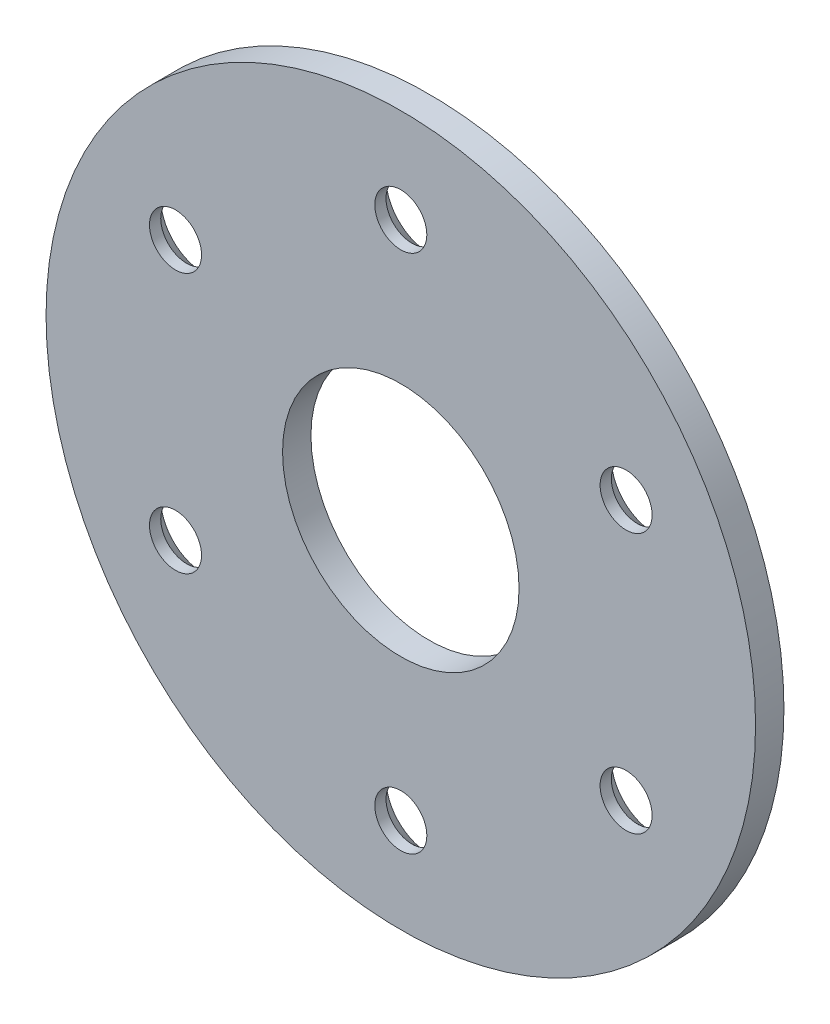
ISO-10303-21;
HEADER;
FILE_DESCRIPTION(('STEP AP214'),'2;1');
FILE_NAME('part.step','',(''),(''),'','','');
FILE_SCHEMA(('AUTOMOTIVE_DESIGN { 1 0 10303 214 1 1 1 1 }'));
ENDSEC;
DATA;
#1=APPLICATION_CONTEXT('core data for automotive mechanical design processes');
#2=APPLICATION_PROTOCOL_DEFINITION('international standard','automotive_design',2000,#1);
#3=PRODUCT_CONTEXT('',#1,'mechanical');
#4=PRODUCT('Part','Part','',(#3));
#5=PRODUCT_RELATED_PRODUCT_CATEGORY('part','',(#4));
#6=PRODUCT_DEFINITION_FORMATION('','',#4);
#7=PRODUCT_DEFINITION_CONTEXT('part definition',#1,'design');
#8=PRODUCT_DEFINITION('design','',#6,#7);
#9=PRODUCT_DEFINITION_SHAPE('','',#8);
#10=(LENGTH_UNIT() NAMED_UNIT(*) SI_UNIT(.MILLI.,.METRE.));
#11=(NAMED_UNIT(*) PLANE_ANGLE_UNIT() SI_UNIT($,.RADIAN.));
#12=(NAMED_UNIT(*) SI_UNIT($,.STERADIAN.) SOLID_ANGLE_UNIT());
#13=UNCERTAINTY_MEASURE_WITH_UNIT(LENGTH_MEASURE(1.E-05),#10,'distance_accuracy_value','');
#14=(GEOMETRIC_REPRESENTATION_CONTEXT(3) GLOBAL_UNCERTAINTY_ASSIGNED_CONTEXT((#13)) GLOBAL_UNIT_ASSIGNED_CONTEXT((#10,
#11,#12)) REPRESENTATION_CONTEXT('',''));
#15=CARTESIAN_POINT('',(0.,0.,0.));
#16=DIRECTION('',(0.,0.,1.));
#17=DIRECTION('',(1.,0.,0.));
#18=AXIS2_PLACEMENT_3D('',#15,#16,#17);
#19=CARTESIAN_POINT('',(0.,0.,3.));
#20=DIRECTION('',(0.,0.,1.));
#21=DIRECTION('',(1.,0.,0.));
#22=AXIS2_PLACEMENT_3D('',#19,#20,#21);
#23=PLANE('',#22);
#24=CARTESIAN_POINT('',(-47.6313972081407,-27.500000000002,3.));
#25=DIRECTION('',(0.,0.,1.));
#26=DIRECTION('',(1.,0.,0.));
#27=AXIS2_PLACEMENT_3D('',#24,#25,#26);
#28=CIRCLE('',#27,5.5);
#29=CARTESIAN_POINT('',(-42.1313972081407,-27.500000000002,3.));
#30=VERTEX_POINT('',#29);
#31=EDGE_CURVE('E80',#30,#30,#28,.T.);
#32=ORIENTED_EDGE('',*,*,#31,.F.);
#33=EDGE_LOOP('',(#32));
#34=FACE_BOUND('',#33,.T.);
#35=CARTESIAN_POINT('',(47.6313972081475,-27.499999999998,3.));
#36=DIRECTION('',(0.,0.,1.));
#37=DIRECTION('',(1.,0.,0.));
#38=AXIS2_PLACEMENT_3D('',#35,#36,#37);
#39=CIRCLE('',#38,5.5);
#40=CARTESIAN_POINT('',(53.1313972081475,-27.499999999998,3.));
#41=VERTEX_POINT('',#40);
#42=EDGE_CURVE('E72',#41,#41,#39,.T.);
#43=ORIENTED_EDGE('',*,*,#42,.F.);
#44=EDGE_LOOP('',(#43));
#45=FACE_BOUND('',#44,.T.);
#46=CARTESIAN_POINT('',(0.,55.,3.));
#47=DIRECTION('',(0.,0.,1.));
#48=DIRECTION('',(1.,0.,0.));
#49=AXIS2_PLACEMENT_3D('',#46,#47,#48);
#50=CIRCLE('',#49,5.5);
#51=CARTESIAN_POINT('',(5.5,55.,3.));
#52=VERTEX_POINT('',#51);
#53=EDGE_CURVE('E61',#52,#52,#50,.T.);
#54=ORIENTED_EDGE('',*,*,#53,.F.);
#55=EDGE_LOOP('',(#54));
#56=FACE_BOUND('',#55,.T.);
#57=CARTESIAN_POINT('',(0.,0.,3.));
#58=DIRECTION('',(0.,0.,1.));
#59=DIRECTION('',(1.,0.,0.));
#60=AXIS2_PLACEMENT_3D('',#57,#58,#59);
#61=CIRCLE('',#60,75.);
#62=CARTESIAN_POINT('',(75.,0.,3.));
#63=VERTEX_POINT('',#62);
#64=EDGE_CURVE('E10',#63,#63,#61,.T.);
#65=ORIENTED_EDGE('',*,*,#64,.T.);
#66=EDGE_LOOP('',(#65));
#67=FACE_BOUND('',#66,.T.);
#68=CARTESIAN_POINT('',(0.,0.,3.));
#69=DIRECTION('',(0.,0.,1.));
#70=DIRECTION('',(1.,0.,0.));
#71=AXIS2_PLACEMENT_3D('',#68,#69,#70);
#72=CIRCLE('',#71,25.);
#73=CARTESIAN_POINT('',(25.,0.,3.));
#74=VERTEX_POINT('',#73);
#75=EDGE_CURVE('E55',#74,#74,#72,.T.);
#76=ORIENTED_EDGE('',*,*,#75,.F.);
#77=EDGE_LOOP('',(#76));
#78=FACE_BOUND('',#77,.T.);
#79=CARTESIAN_POINT('',(47.6313972081453,27.500000000002,3.));
#80=DIRECTION('',(0.,0.,1.));
#81=DIRECTION('',(1.,0.,0.));
#82=AXIS2_PLACEMENT_3D('',#79,#80,#81);
#83=CIRCLE('',#82,5.5);
#84=CARTESIAN_POINT('',(53.1313972081453,27.500000000002,3.));
#85=VERTEX_POINT('',#84);
#86=EDGE_CURVE('E68',#85,#85,#83,.T.);
#87=ORIENTED_EDGE('',*,*,#86,.F.);
#88=EDGE_LOOP('',(#87));
#89=FACE_BOUND('',#88,.T.);
#90=CARTESIAN_POINT('',(4.5346147174736E-12,-55.,3.));
#91=DIRECTION('',(0.,0.,1.));
#92=DIRECTION('',(1.,0.,0.));
#93=AXIS2_PLACEMENT_3D('',#90,#91,#92);
#94=CIRCLE('',#93,5.5);
#95=CARTESIAN_POINT('',(5.50000000000453,-55.,3.));
#96=VERTEX_POINT('',#95);
#97=EDGE_CURVE('E76',#96,#96,#94,.T.);
#98=ORIENTED_EDGE('',*,*,#97,.F.);
#99=EDGE_LOOP('',(#98));
#100=FACE_BOUND('',#99,.T.);
#101=CARTESIAN_POINT('',(-47.631397208143,27.499999999998,3.));
#102=DIRECTION('',(0.,0.,1.));
#103=DIRECTION('',(1.,0.,0.));
#104=AXIS2_PLACEMENT_3D('',#101,#102,#103);
#105=CIRCLE('',#104,5.5);
#106=CARTESIAN_POINT('',(-42.131397208143,27.499999999998,3.));
#107=VERTEX_POINT('',#106);
#108=EDGE_CURVE('E84',#107,#107,#105,.T.);
#109=ORIENTED_EDGE('',*,*,#108,.F.);
#110=EDGE_LOOP('',(#109));
#111=FACE_BOUND('',#110,.T.);
#112=ADVANCED_FACE('F41',(#34,#45,#56,#67,#78,#89,#100,#111),#23,.T.);
#113=CARTESIAN_POINT('',(0.,0.,-3.));
#114=DIRECTION('',(0.,0.,1.));
#115=DIRECTION('',(1.,0.,0.));
#116=AXIS2_PLACEMENT_3D('',#113,#114,#115);
#117=PLANE('',#116);
#118=CARTESIAN_POINT('',(0.,55.,-3.));
#119=DIRECTION('',(0.,0.,-1.));
#120=DIRECTION('',(-1.,0.,0.));
#121=AXIS2_PLACEMENT_3D('',#118,#119,#120);
#122=CIRCLE('',#121,9.125);
#123=CARTESIAN_POINT('',(-9.125,55.,-3.));
#124=VERTEX_POINT('',#123);
#125=EDGE_CURVE('E132',#124,#124,#122,.T.);
#126=ORIENTED_EDGE('',*,*,#125,.F.);
#127=EDGE_LOOP('',(#126));
#128=FACE_BOUND('',#127,.T.);
#129=CARTESIAN_POINT('',(-47.631397208143,27.499999999998,-3.));
#130=DIRECTION('',(0.,0.,-1.));
#131=DIRECTION('',(-1.,0.,0.));
#132=AXIS2_PLACEMENT_3D('',#129,#130,#131);
#133=CIRCLE('',#132,9.125);
#134=CARTESIAN_POINT('',(-56.756397208143,27.499999999998,-3.));
#135=VERTEX_POINT('',#134);
#136=EDGE_CURVE('E124',#135,#135,#133,.T.);
#137=ORIENTED_EDGE('',*,*,#136,.F.);
#138=EDGE_LOOP('',(#137));
#139=FACE_BOUND('',#138,.T.);
#140=CARTESIAN_POINT('',(-47.6313972081407,-27.500000000002,-3.));
#141=DIRECTION('',(0.,0.,-1.));
#142=DIRECTION('',(-1.,0.,0.));
#143=AXIS2_PLACEMENT_3D('',#140,#141,#142);
#144=CIRCLE('',#143,9.125);
#145=CARTESIAN_POINT('',(-56.7563972081407,-27.500000000002,-3.));
#146=VERTEX_POINT('',#145);
#147=EDGE_CURVE('E116',#146,#146,#144,.T.);
#148=ORIENTED_EDGE('',*,*,#147,.F.);
#149=EDGE_LOOP('',(#148));
#150=FACE_BOUND('',#149,.T.);
#151=CARTESIAN_POINT('',(4.5346147174736E-12,-55.,-3.));
#152=DIRECTION('',(0.,0.,-1.));
#153=DIRECTION('',(-1.,0.,0.));
#154=AXIS2_PLACEMENT_3D('',#151,#152,#153);
#155=CIRCLE('',#154,9.125);
#156=CARTESIAN_POINT('',(-9.12499999999546,-55.,-3.));
#157=VERTEX_POINT('',#156);
#158=EDGE_CURVE('E108',#157,#157,#155,.T.);
#159=ORIENTED_EDGE('',*,*,#158,.F.);
#160=EDGE_LOOP('',(#159));
#161=FACE_BOUND('',#160,.T.);
#162=CARTESIAN_POINT('',(47.6313972081475,-27.499999999998,-3.));
#163=DIRECTION('',(0.,0.,-1.));
#164=DIRECTION('',(-1.,0.,0.));
#165=AXIS2_PLACEMENT_3D('',#162,#163,#164);
#166=CIRCLE('',#165,9.125);
#167=CARTESIAN_POINT('',(38.5063972081475,-27.499999999998,-3.));
#168=VERTEX_POINT('',#167);
#169=EDGE_CURVE('E100',#168,#168,#166,.T.);
#170=ORIENTED_EDGE('',*,*,#169,.F.);
#171=EDGE_LOOP('',(#170));
#172=FACE_BOUND('',#171,.T.);
#173=CARTESIAN_POINT('',(47.6313972081453,27.500000000002,-3.));
#174=DIRECTION('',(0.,0.,-1.));
#175=DIRECTION('',(-1.,0.,0.));
#176=AXIS2_PLACEMENT_3D('',#173,#174,#175);
#177=CIRCLE('',#176,9.125);
#178=CARTESIAN_POINT('',(38.5063972081453,27.500000000002,-3.));
#179=VERTEX_POINT('',#178);
#180=EDGE_CURVE('E92',#179,#179,#177,.T.);
#181=ORIENTED_EDGE('',*,*,#180,.F.);
#182=EDGE_LOOP('',(#181));
#183=FACE_BOUND('',#182,.T.);
#184=CARTESIAN_POINT('',(0.,0.,-3.));
#185=DIRECTION('',(0.,0.,1.));
#186=DIRECTION('',(1.,0.,0.));
#187=AXIS2_PLACEMENT_3D('',#184,#185,#186);
#188=CIRCLE('',#187,75.);
#189=CARTESIAN_POINT('',(75.,0.,-3.));
#190=VERTEX_POINT('',#189);
#191=EDGE_CURVE('E45',#190,#190,#188,.T.);
#192=ORIENTED_EDGE('',*,*,#191,.F.);
#193=EDGE_LOOP('',(#192));
#194=FACE_BOUND('',#193,.T.);
#195=CARTESIAN_POINT('',(0.,0.,-3.));
#196=DIRECTION('',(0.,0.,1.));
#197=DIRECTION('',(1.,0.,0.));
#198=AXIS2_PLACEMENT_3D('',#195,#196,#197);
#199=CIRCLE('',#198,25.);
#200=CARTESIAN_POINT('',(25.,0.,-3.));
#201=VERTEX_POINT('',#200);
#202=EDGE_CURVE('E57',#201,#201,#199,.T.);
#203=ORIENTED_EDGE('',*,*,#202,.T.);
#204=EDGE_LOOP('',(#203));
#205=FACE_BOUND('',#204,.T.);
#206=ADVANCED_FACE('F140',(#128,#139,#150,#161,#172,#183,#194,#205),#117,.F.);
#207=CARTESIAN_POINT('',(0.,0.,3.));
#208=DIRECTION('',(0.,0.,-1.));
#209=DIRECTION('',(-1.,0.,0.));
#210=AXIS2_PLACEMENT_3D('',#207,#208,#209);
#211=CYLINDRICAL_SURFACE('',#210,75.);
#212=ORIENTED_EDGE('',*,*,#64,.F.);
#213=EDGE_LOOP('',(#212));
#214=FACE_BOUND('',#213,.T.);
#215=ORIENTED_EDGE('',*,*,#191,.T.);
#216=EDGE_LOOP('',(#215));
#217=FACE_BOUND('',#216,.T.);
#218=ADVANCED_FACE('F43',(#214,#217),#211,.T.);
#219=CARTESIAN_POINT('',(0.,0.,3.));
#220=DIRECTION('',(0.,0.,-1.));
#221=DIRECTION('',(-1.,0.,0.));
#222=AXIS2_PLACEMENT_3D('',#219,#220,#221);
#223=CYLINDRICAL_SURFACE('',#222,25.);
#224=ORIENTED_EDGE('',*,*,#75,.T.);
#225=EDGE_LOOP('',(#224));
#226=FACE_BOUND('',#225,.T.);
#227=ORIENTED_EDGE('',*,*,#202,.F.);
#228=EDGE_LOOP('',(#227));
#229=FACE_BOUND('',#228,.T.);
#230=ADVANCED_FACE('F157',(#226,#229),#223,.F.);
#231=CARTESIAN_POINT('',(0.,55.,3.));
#232=DIRECTION('',(0.,0.,-1.));
#233=DIRECTION('',(-1.,0.,0.));
#234=AXIS2_PLACEMENT_3D('',#231,#232,#233);
#235=CYLINDRICAL_SURFACE('',#234,5.5);
#236=CARTESIAN_POINT('',(0.,55.,0.625000000000002));
#237=DIRECTION('',(0.,0.,-1.));
#238=DIRECTION('',(-1.,0.,0.));
#239=AXIS2_PLACEMENT_3D('',#236,#237,#238);
#240=CIRCLE('',#239,5.5);
#241=CARTESIAN_POINT('',(-5.5,55.,0.625000000000002));
#242=VERTEX_POINT('',#241);
#243=EDGE_CURVE('E128',#242,#242,#240,.F.);
#244=ORIENTED_EDGE('',*,*,#243,.F.);
#245=EDGE_LOOP('',(#244));
#246=FACE_BOUND('',#245,.T.);
#247=ORIENTED_EDGE('',*,*,#53,.T.);
#248=EDGE_LOOP('',(#247));
#249=FACE_BOUND('',#248,.T.);
#250=ADVANCED_FACE('F159',(#246,#249),#235,.F.);
#251=CARTESIAN_POINT('',(47.6313972081453,27.500000000002,3.));
#252=DIRECTION('',(0.,0.,-1.));
#253=DIRECTION('',(-1.,0.,0.));
#254=AXIS2_PLACEMENT_3D('',#251,#252,#253);
#255=CYLINDRICAL_SURFACE('',#254,5.5);
#256=CARTESIAN_POINT('',(47.6313972081453,27.500000000002,0.625000000000002));
#257=DIRECTION('',(0.,0.,-1.));
#258=DIRECTION('',(-1.,0.,0.));
#259=AXIS2_PLACEMENT_3D('',#256,#257,#258);
#260=CIRCLE('',#259,5.5);
#261=CARTESIAN_POINT('',(42.1313972081453,27.500000000002,0.625000000000002));
#262=VERTEX_POINT('',#261);
#263=EDGE_CURVE('E88',#262,#262,#260,.F.);
#264=ORIENTED_EDGE('',*,*,#263,.F.);
#265=EDGE_LOOP('',(#264));
#266=FACE_BOUND('',#265,.T.);
#267=ORIENTED_EDGE('',*,*,#86,.T.);
#268=EDGE_LOOP('',(#267));
#269=FACE_BOUND('',#268,.T.);
#270=ADVANCED_FACE('F166',(#266,#269),#255,.F.);
#271=CARTESIAN_POINT('',(47.6313972081475,-27.499999999998,3.));
#272=DIRECTION('',(0.,0.,-1.));
#273=DIRECTION('',(-1.,0.,0.));
#274=AXIS2_PLACEMENT_3D('',#271,#272,#273);
#275=CYLINDRICAL_SURFACE('',#274,5.5);
#276=CARTESIAN_POINT('',(47.6313972081475,-27.499999999998,0.625000000000002));
#277=DIRECTION('',(0.,0.,-1.));
#278=DIRECTION('',(-1.,0.,0.));
#279=AXIS2_PLACEMENT_3D('',#276,#277,#278);
#280=CIRCLE('',#279,5.5);
#281=CARTESIAN_POINT('',(42.1313972081475,-27.499999999998,0.625000000000002));
#282=VERTEX_POINT('',#281);
#283=EDGE_CURVE('E96',#282,#282,#280,.F.);
#284=ORIENTED_EDGE('',*,*,#283,.F.);
#285=EDGE_LOOP('',(#284));
#286=FACE_BOUND('',#285,.T.);
#287=ORIENTED_EDGE('',*,*,#42,.T.);
#288=EDGE_LOOP('',(#287));
#289=FACE_BOUND('',#288,.T.);
#290=ADVANCED_FACE('F210',(#286,#289),#275,.F.);
#291=CARTESIAN_POINT('',(4.5346147174736E-12,-55.,3.));
#292=DIRECTION('',(0.,0.,-1.));
#293=DIRECTION('',(-1.,0.,0.));
#294=AXIS2_PLACEMENT_3D('',#291,#292,#293);
#295=CYLINDRICAL_SURFACE('',#294,5.5);
#296=CARTESIAN_POINT('',(4.5346147174736E-12,-55.,0.625000000000002));
#297=DIRECTION('',(0.,0.,-1.));
#298=DIRECTION('',(-1.,0.,0.));
#299=AXIS2_PLACEMENT_3D('',#296,#297,#298);
#300=CIRCLE('',#299,5.5);
#301=CARTESIAN_POINT('',(-5.49999999999546,-55.,0.625000000000002));
#302=VERTEX_POINT('',#301);
#303=EDGE_CURVE('E104',#302,#302,#300,.F.);
#304=ORIENTED_EDGE('',*,*,#303,.F.);
#305=EDGE_LOOP('',(#304));
#306=FACE_BOUND('',#305,.T.);
#307=ORIENTED_EDGE('',*,*,#97,.T.);
#308=EDGE_LOOP('',(#307));
#309=FACE_BOUND('',#308,.T.);
#310=ADVANCED_FACE('F202',(#306,#309),#295,.F.);
#311=CARTESIAN_POINT('',(-47.6313972081407,-27.500000000002,3.));
#312=DIRECTION('',(0.,0.,-1.));
#313=DIRECTION('',(-1.,0.,0.));
#314=AXIS2_PLACEMENT_3D('',#311,#312,#313);
#315=CYLINDRICAL_SURFACE('',#314,5.5);
#316=CARTESIAN_POINT('',(-47.6313972081407,-27.500000000002,0.625000000000002));
#317=DIRECTION('',(0.,0.,-1.));
#318=DIRECTION('',(-1.,0.,0.));
#319=AXIS2_PLACEMENT_3D('',#316,#317,#318);
#320=CIRCLE('',#319,5.5);
#321=CARTESIAN_POINT('',(-53.1313972081407,-27.500000000002,0.625000000000002));
#322=VERTEX_POINT('',#321);
#323=EDGE_CURVE('E112',#322,#322,#320,.F.);
#324=ORIENTED_EDGE('',*,*,#323,.F.);
#325=EDGE_LOOP('',(#324));
#326=FACE_BOUND('',#325,.T.);
#327=ORIENTED_EDGE('',*,*,#31,.T.);
#328=EDGE_LOOP('',(#327));
#329=FACE_BOUND('',#328,.T.);
#330=ADVANCED_FACE('F192',(#326,#329),#315,.F.);
#331=CARTESIAN_POINT('',(-47.631397208143,27.499999999998,3.));
#332=DIRECTION('',(0.,0.,-1.));
#333=DIRECTION('',(-1.,0.,0.));
#334=AXIS2_PLACEMENT_3D('',#331,#332,#333);
#335=CYLINDRICAL_SURFACE('',#334,5.5);
#336=CARTESIAN_POINT('',(-47.631397208143,27.499999999998,0.625000000000002));
#337=DIRECTION('',(0.,0.,-1.));
#338=DIRECTION('',(-1.,0.,0.));
#339=AXIS2_PLACEMENT_3D('',#336,#337,#338);
#340=CIRCLE('',#339,5.5);
#341=CARTESIAN_POINT('',(-53.131397208143,27.499999999998,0.625000000000002));
#342=VERTEX_POINT('',#341);
#343=EDGE_CURVE('E120',#342,#342,#340,.F.);
#344=ORIENTED_EDGE('',*,*,#343,.F.);
#345=EDGE_LOOP('',(#344));
#346=FACE_BOUND('',#345,.T.);
#347=ORIENTED_EDGE('',*,*,#108,.T.);
#348=EDGE_LOOP('',(#347));
#349=FACE_BOUND('',#348,.T.);
#350=ADVANCED_FACE('F189',(#346,#349),#335,.F.);
#351=CARTESIAN_POINT('',(47.6313972081453,27.500000000002,-3.));
#352=DIRECTION('',(0.,0.,-1.));
#353=DIRECTION('',(-1.,0.,0.));
#354=AXIS2_PLACEMENT_3D('',#351,#352,#353);
#355=CONICAL_SURFACE('',#354,9.125,0.785398163397449);
#356=ORIENTED_EDGE('',*,*,#263,.T.);
#357=EDGE_LOOP('',(#356));
#358=FACE_BOUND('',#357,.T.);
#359=ORIENTED_EDGE('',*,*,#180,.T.);
#360=EDGE_LOOP('',(#359));
#361=FACE_BOUND('',#360,.T.);
#362=ADVANCED_FACE('F191',(#358,#361),#355,.F.);
#363=CARTESIAN_POINT('',(47.6313972081475,-27.499999999998,-3.));
#364=DIRECTION('',(0.,0.,-1.));
#365=DIRECTION('',(-1.,0.,0.));
#366=AXIS2_PLACEMENT_3D('',#363,#364,#365);
#367=CONICAL_SURFACE('',#366,9.125,0.785398163397449);
#368=ORIENTED_EDGE('',*,*,#283,.T.);
#369=EDGE_LOOP('',(#368));
#370=FACE_BOUND('',#369,.T.);
#371=ORIENTED_EDGE('',*,*,#169,.T.);
#372=EDGE_LOOP('',(#371));
#373=FACE_BOUND('',#372,.T.);
#374=ADVANCED_FACE('F199',(#370,#373),#367,.F.);
#375=CARTESIAN_POINT('',(4.5346147174736E-12,-55.,-3.));
#376=DIRECTION('',(0.,0.,-1.));
#377=DIRECTION('',(-1.,0.,0.));
#378=AXIS2_PLACEMENT_3D('',#375,#376,#377);
#379=CONICAL_SURFACE('',#378,9.125,0.785398163397448);
#380=ORIENTED_EDGE('',*,*,#303,.T.);
#381=EDGE_LOOP('',(#380));
#382=FACE_BOUND('',#381,.T.);
#383=ORIENTED_EDGE('',*,*,#158,.T.);
#384=EDGE_LOOP('',(#383));
#385=FACE_BOUND('',#384,.T.);
#386=ADVANCED_FACE('F259',(#382,#385),#379,.F.);
#387=CARTESIAN_POINT('',(-47.6313972081407,-27.500000000002,-3.));
#388=DIRECTION('',(0.,0.,-1.));
#389=DIRECTION('',(-1.,0.,0.));
#390=AXIS2_PLACEMENT_3D('',#387,#388,#389);
#391=CONICAL_SURFACE('',#390,9.125,0.785398163397449);
#392=ORIENTED_EDGE('',*,*,#323,.T.);
#393=EDGE_LOOP('',(#392));
#394=FACE_BOUND('',#393,.T.);
#395=ORIENTED_EDGE('',*,*,#147,.T.);
#396=EDGE_LOOP('',(#395));
#397=FACE_BOUND('',#396,.T.);
#398=ADVANCED_FACE('F268',(#394,#397),#391,.F.);
#399=CARTESIAN_POINT('',(-47.631397208143,27.499999999998,-3.));
#400=DIRECTION('',(0.,0.,-1.));
#401=DIRECTION('',(-1.,0.,0.));
#402=AXIS2_PLACEMENT_3D('',#399,#400,#401);
#403=CONICAL_SURFACE('',#402,9.125,0.785398163397449);
#404=ORIENTED_EDGE('',*,*,#343,.T.);
#405=EDGE_LOOP('',(#404));
#406=FACE_BOUND('',#405,.T.);
#407=ORIENTED_EDGE('',*,*,#136,.T.);
#408=EDGE_LOOP('',(#407));
#409=FACE_BOUND('',#408,.T.);
#410=ADVANCED_FACE('F278',(#406,#409),#403,.F.);
#411=CARTESIAN_POINT('',(0.,55.,-3.));
#412=DIRECTION('',(0.,0.,-1.));
#413=DIRECTION('',(-1.,0.,0.));
#414=AXIS2_PLACEMENT_3D('',#411,#412,#413);
#415=CONICAL_SURFACE('',#414,9.125,0.785398163397448);
#416=ORIENTED_EDGE('',*,*,#243,.T.);
#417=EDGE_LOOP('',(#416));
#418=FACE_BOUND('',#417,.T.);
#419=ORIENTED_EDGE('',*,*,#125,.T.);
#420=EDGE_LOOP('',(#419));
#421=FACE_BOUND('',#420,.T.);
#422=ADVANCED_FACE('F138',(#418,#421),#415,.F.);
#423=CLOSED_SHELL('',(#112,#206,#218,#230,#250,#270,#290,#310,#330,#350,#362,#374,#386,#398,
#410,#422));
#424=MANIFOLD_SOLID_BREP('B2',#423);
#425=ADVANCED_BREP_SHAPE_REPRESENTATION('',(#18,#424),#14);
#426=SHAPE_DEFINITION_REPRESENTATION(#9,#425);
ENDSEC;
END-ISO-10303-21;
